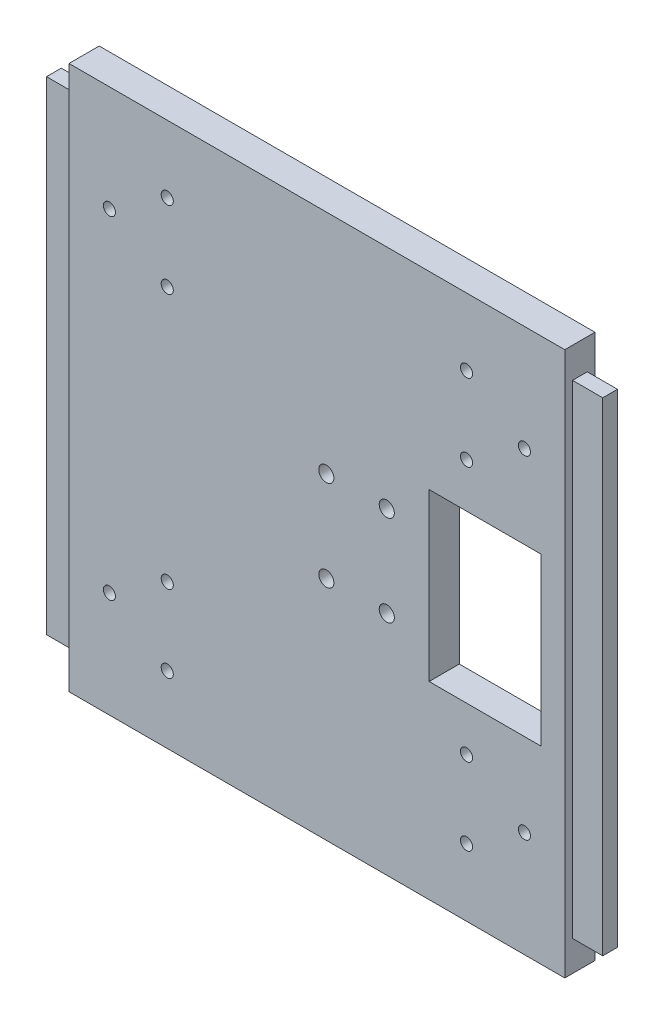
ISO-10303-21;
HEADER;
FILE_DESCRIPTION(('STEP AP214'),'2;1');
FILE_NAME('part.step','',(''),(''),'','','');
FILE_SCHEMA(('AUTOMOTIVE_DESIGN { 1 0 10303 214 1 1 1 1 }'));
ENDSEC;
DATA;
#1=APPLICATION_CONTEXT('core data for automotive mechanical design processes');
#2=APPLICATION_PROTOCOL_DEFINITION('international standard','automotive_design',2000,#1);
#3=PRODUCT_CONTEXT('',#1,'mechanical');
#4=PRODUCT('Part','Part','',(#3));
#5=PRODUCT_RELATED_PRODUCT_CATEGORY('part','',(#4));
#6=PRODUCT_DEFINITION_FORMATION('','',#4);
#7=PRODUCT_DEFINITION_CONTEXT('part definition',#1,'design');
#8=PRODUCT_DEFINITION('design','',#6,#7);
#9=PRODUCT_DEFINITION_SHAPE('','',#8);
#10=(LENGTH_UNIT() NAMED_UNIT(*) SI_UNIT(.MILLI.,.METRE.));
#11=(NAMED_UNIT(*) PLANE_ANGLE_UNIT() SI_UNIT($,.RADIAN.));
#12=(NAMED_UNIT(*) SI_UNIT($,.STERADIAN.) SOLID_ANGLE_UNIT());
#13=UNCERTAINTY_MEASURE_WITH_UNIT(LENGTH_MEASURE(1.E-05),#10,'distance_accuracy_value','');
#14=(GEOMETRIC_REPRESENTATION_CONTEXT(3) GLOBAL_UNCERTAINTY_ASSIGNED_CONTEXT((#13)) GLOBAL_UNIT_ASSIGNED_CONTEXT((#10,
#11,#12)) REPRESENTATION_CONTEXT('',''));
#15=CARTESIAN_POINT('',(0.,0.,0.));
#16=DIRECTION('',(0.,0.,1.));
#17=DIRECTION('',(1.,0.,0.));
#18=AXIS2_PLACEMENT_3D('',#15,#16,#17);
#19=CARTESIAN_POINT('',(0.,0.,10.));
#20=DIRECTION('',(1.,0.,0.));
#21=DIRECTION('',(0.,0.,-1.));
#22=AXIS2_PLACEMENT_3D('',#19,#20,#21);
#23=PLANE('',#22);
#24=DIRECTION('',(0.,-1.,0.));
#25=VECTOR('',#24,1.);
#26=CARTESIAN_POINT('',(0.,0.,0.));
#27=LINE('',#26,#25);
#28=CARTESIAN_POINT('',(0.,180.,0.));
#29=VERTEX_POINT('',#28);
#30=CARTESIAN_POINT('',(0.,0.,0.));
#31=VERTEX_POINT('',#30);
#32=EDGE_CURVE('E189',#29,#31,#27,.T.);
#33=ORIENTED_EDGE('',*,*,#32,.T.);
#34=DIRECTION('',(0.,0.,-1.));
#35=VECTOR('',#34,1.);
#36=CARTESIAN_POINT('',(0.,0.,10.));
#37=LINE('',#36,#35);
#38=CARTESIAN_POINT('',(0.,0.,10.));
#39=VERTEX_POINT('',#38);
#40=EDGE_CURVE('E162',#39,#31,#37,.T.);
#41=ORIENTED_EDGE('',*,*,#40,.F.);
#42=DIRECTION('',(0.,-1.,0.));
#43=VECTOR('',#42,1.);
#44=CARTESIAN_POINT('',(0.,0.,10.));
#45=LINE('',#44,#43);
#46=CARTESIAN_POINT('',(0.,180.,10.));
#47=VERTEX_POINT('',#46);
#48=EDGE_CURVE('E184',#47,#39,#45,.T.);
#49=ORIENTED_EDGE('',*,*,#48,.F.);
#50=DIRECTION('',(0.,0.,-1.));
#51=VECTOR('',#50,1.);
#52=CARTESIAN_POINT('',(0.,180.,10.));
#53=LINE('',#52,#51);
#54=EDGE_CURVE('E178',#47,#29,#53,.T.);
#55=ORIENTED_EDGE('',*,*,#54,.T.);
#56=EDGE_LOOP('',(#33,#41,#49,#55));
#57=FACE_BOUND('',#56,.T.);
#58=DIRECTION('',(0.,-1.,0.));
#59=VECTOR('',#58,1.);
#60=CARTESIAN_POINT('',(0.,169.94,2.55999999999999));
#61=LINE('',#60,#59);
#62=CARTESIAN_POINT('',(0.,169.94,2.55999999999999));
#63=VERTEX_POINT('',#62);
#64=CARTESIAN_POINT('',(0.,10.06,2.56000000000001));
#65=VERTEX_POINT('',#64);
#66=EDGE_CURVE('E222',#63,#65,#61,.T.);
#67=ORIENTED_EDGE('',*,*,#66,.F.);
#68=DIRECTION('',(0.,0.,-1.));
#69=VECTOR('',#68,1.);
#70=CARTESIAN_POINT('',(0.,169.94,2.55999999999999));
#71=LINE('',#70,#69);
#72=CARTESIAN_POINT('',(0.,169.94,7.43999999999999));
#73=VERTEX_POINT('',#72);
#74=EDGE_CURVE('E212',#73,#63,#71,.T.);
#75=ORIENTED_EDGE('',*,*,#74,.F.);
#76=DIRECTION('',(0.,1.,0.));
#77=VECTOR('',#76,1.);
#78=CARTESIAN_POINT('',(0.,169.94,7.43999999999999));
#79=LINE('',#78,#77);
#80=CARTESIAN_POINT('',(0.,10.06,7.44000000000001));
#81=VERTEX_POINT('',#80);
#82=EDGE_CURVE('E216',#81,#73,#79,.T.);
#83=ORIENTED_EDGE('',*,*,#82,.F.);
#84=DIRECTION('',(0.,0.,1.));
#85=VECTOR('',#84,1.);
#86=CARTESIAN_POINT('',(0.,10.06,2.56000000000001));
#87=LINE('',#86,#85);
#88=EDGE_CURVE('E219',#65,#81,#87,.T.);
#89=ORIENTED_EDGE('',*,*,#88,.F.);
#90=EDGE_LOOP('',(#67,#75,#83,#89));
#91=FACE_BOUND('',#90,.T.);
#92=ADVANCED_FACE('F37',(#57,#91),#23,.F.);
#93=CARTESIAN_POINT('',(0.,0.,10.));
#94=DIRECTION('',(0.,1.,0.));
#95=DIRECTION('',(0.,0.,1.));
#96=AXIS2_PLACEMENT_3D('',#93,#94,#95);
#97=PLANE('',#96);
#98=DIRECTION('',(1.,0.,0.));
#99=VECTOR('',#98,1.);
#100=CARTESIAN_POINT('',(0.,0.,0.));
#101=LINE('',#100,#99);
#102=CARTESIAN_POINT('',(164.,0.,0.));
#103=VERTEX_POINT('',#102);
#104=EDGE_CURVE('E187',#31,#103,#101,.T.);
#105=ORIENTED_EDGE('',*,*,#104,.T.);
#106=DIRECTION('',(0.,0.,-1.));
#107=VECTOR('',#106,1.);
#108=CARTESIAN_POINT('',(164.,0.,10.));
#109=LINE('',#108,#107);
#110=CARTESIAN_POINT('',(164.,0.,10.));
#111=VERTEX_POINT('',#110);
#112=EDGE_CURVE('E172',#111,#103,#109,.T.);
#113=ORIENTED_EDGE('',*,*,#112,.F.);
#114=DIRECTION('',(1.,0.,0.));
#115=VECTOR('',#114,1.);
#116=CARTESIAN_POINT('',(0.,0.,10.));
#117=LINE('',#116,#115);
#118=EDGE_CURVE('E196',#39,#111,#117,.T.);
#119=ORIENTED_EDGE('',*,*,#118,.F.);
#120=ORIENTED_EDGE('',*,*,#40,.T.);
#121=EDGE_LOOP('',(#105,#113,#119,#120));
#122=FACE_BOUND('',#121,.T.);
#123=ADVANCED_FACE('F425',(#122),#97,.F.);
#124=CARTESIAN_POINT('',(164.,0.,10.));
#125=DIRECTION('',(-1.,0.,0.));
#126=DIRECTION('',(0.,0.,1.));
#127=AXIS2_PLACEMENT_3D('',#124,#125,#126);
#128=PLANE('',#127);
#129=DIRECTION('',(0.,0.,-1.));
#130=VECTOR('',#129,1.);
#131=CARTESIAN_POINT('',(164.,169.94,2.55999999999999));
#132=LINE('',#131,#130);
#133=CARTESIAN_POINT('',(164.,169.94,7.43999999999999));
#134=VERTEX_POINT('',#133);
#135=CARTESIAN_POINT('',(164.,169.94,2.55999999999999));
#136=VERTEX_POINT('',#135);
#137=EDGE_CURVE('E249',#134,#136,#132,.T.);
#138=ORIENTED_EDGE('',*,*,#137,.T.);
#139=DIRECTION('',(0.,-1.,0.));
#140=VECTOR('',#139,1.);
#141=CARTESIAN_POINT('',(164.,169.94,2.55999999999999));
#142=LINE('',#141,#140);
#143=CARTESIAN_POINT('',(164.,10.06,2.56000000000001));
#144=VERTEX_POINT('',#143);
#145=EDGE_CURVE('E252',#136,#144,#142,.T.);
#146=ORIENTED_EDGE('',*,*,#145,.T.);
#147=DIRECTION('',(0.,0.,1.));
#148=VECTOR('',#147,1.);
#149=CARTESIAN_POINT('',(164.,10.06,2.56000000000001));
#150=LINE('',#149,#148);
#151=CARTESIAN_POINT('',(164.,10.06,7.44000000000001));
#152=VERTEX_POINT('',#151);
#153=EDGE_CURVE('E242',#144,#152,#150,.T.);
#154=ORIENTED_EDGE('',*,*,#153,.T.);
#155=DIRECTION('',(0.,1.,0.));
#156=VECTOR('',#155,1.);
#157=CARTESIAN_POINT('',(164.,169.94,7.43999999999999));
#158=LINE('',#157,#156);
#159=EDGE_CURVE('E246',#152,#134,#158,.T.);
#160=ORIENTED_EDGE('',*,*,#159,.T.);
#161=EDGE_LOOP('',(#138,#146,#154,#160));
#162=FACE_BOUND('',#161,.T.);
#163=DIRECTION('',(0.,1.,0.));
#164=VECTOR('',#163,1.);
#165=CARTESIAN_POINT('',(164.,0.,0.));
#166=LINE('',#165,#164);
#167=CARTESIAN_POINT('',(164.,180.,0.));
#168=VERTEX_POINT('',#167);
#169=EDGE_CURVE('E185',#103,#168,#166,.T.);
#170=ORIENTED_EDGE('',*,*,#169,.T.);
#171=DIRECTION('',(0.,0.,-1.));
#172=VECTOR('',#171,1.);
#173=CARTESIAN_POINT('',(164.,180.,10.));
#174=LINE('',#173,#172);
#175=CARTESIAN_POINT('',(164.,180.,10.));
#176=VERTEX_POINT('',#175);
#177=EDGE_CURVE('E175',#176,#168,#174,.T.);
#178=ORIENTED_EDGE('',*,*,#177,.F.);
#179=DIRECTION('',(0.,1.,0.));
#180=VECTOR('',#179,1.);
#181=CARTESIAN_POINT('',(164.,0.,10.));
#182=LINE('',#181,#180);
#183=EDGE_CURVE('E194',#111,#176,#182,.T.);
#184=ORIENTED_EDGE('',*,*,#183,.F.);
#185=ORIENTED_EDGE('',*,*,#112,.T.);
#186=EDGE_LOOP('',(#170,#178,#184,#185));
#187=FACE_BOUND('',#186,.T.);
#188=ADVANCED_FACE('F430',(#162,#187),#128,.F.);
#189=CARTESIAN_POINT('',(0.,180.,10.));
#190=DIRECTION('',(0.,-1.,0.));
#191=DIRECTION('',(0.,0.,-1.));
#192=AXIS2_PLACEMENT_3D('',#189,#190,#191);
#193=PLANE('',#192);
#194=DIRECTION('',(-1.,0.,0.));
#195=VECTOR('',#194,1.);
#196=CARTESIAN_POINT('',(0.,180.,0.));
#197=LINE('',#196,#195);
#198=EDGE_CURVE('E182',#168,#29,#197,.T.);
#199=ORIENTED_EDGE('',*,*,#198,.T.);
#200=ORIENTED_EDGE('',*,*,#54,.F.);
#201=DIRECTION('',(-1.,0.,0.));
#202=VECTOR('',#201,1.);
#203=CARTESIAN_POINT('',(0.,180.,10.));
#204=LINE('',#203,#202);
#205=EDGE_CURVE('E181',#176,#47,#204,.T.);
#206=ORIENTED_EDGE('',*,*,#205,.F.);
#207=ORIENTED_EDGE('',*,*,#177,.T.);
#208=EDGE_LOOP('',(#199,#200,#206,#207));
#209=FACE_BOUND('',#208,.T.);
#210=ADVANCED_FACE('F385',(#209),#193,.F.);
#211=CARTESIAN_POINT('',(0.,0.,10.));
#212=DIRECTION('',(0.,0.,-1.));
#213=DIRECTION('',(-1.,0.,0.));
#214=AXIS2_PLACEMENT_3D('',#211,#212,#213);
#215=PLANE('',#214);
#216=CARTESIAN_POINT('',(85.1178631754565,75.,10.));
#217=DIRECTION('',(0.,0.,1.));
#218=DIRECTION('',(1.,0.,0.));
#219=AXIS2_PLACEMENT_3D('',#216,#217,#218);
#220=CIRCLE('',#219,2.5);
#221=CARTESIAN_POINT('',(87.6178631754566,75.,10.));
#222=VERTEX_POINT('',#221);
#223=EDGE_CURVE('E153',#222,#222,#220,.T.);
#224=ORIENTED_EDGE('',*,*,#223,.F.);
#225=EDGE_LOOP('',(#224));
#226=FACE_BOUND('',#225,.T.);
#227=DIRECTION('',(1.,0.,0.));
#228=VECTOR('',#227,1.);
#229=CARTESIAN_POINT('',(119.117863175457,62.5,10.));
#230=LINE('',#229,#228);
#231=CARTESIAN_POINT('',(119.117863175457,62.5,10.));
#232=VERTEX_POINT('',#231);
#233=CARTESIAN_POINT('',(156.117863175457,62.5,10.));
#234=VERTEX_POINT('',#233);
#235=EDGE_CURVE('E352',#232,#234,#230,.T.);
#236=ORIENTED_EDGE('',*,*,#235,.F.);
#237=DIRECTION('',(0.,-1.,0.));
#238=VECTOR('',#237,1.);
#239=CARTESIAN_POINT('',(119.117863175457,117.5,10.));
#240=LINE('',#239,#238);
#241=CARTESIAN_POINT('',(119.117863175457,117.5,10.));
#242=VERTEX_POINT('',#241);
#243=EDGE_CURVE('E56',#242,#232,#240,.T.);
#244=ORIENTED_EDGE('',*,*,#243,.F.);
#245=DIRECTION('',(-1.,0.,0.));
#246=VECTOR('',#245,1.);
#247=CARTESIAN_POINT('',(119.117863175457,117.5,10.));
#248=LINE('',#247,#246);
#249=CARTESIAN_POINT('',(156.117863175457,117.5,10.));
#250=VERTEX_POINT('',#249);
#251=EDGE_CURVE('E152',#250,#242,#248,.T.);
#252=ORIENTED_EDGE('',*,*,#251,.F.);
#253=DIRECTION('',(0.,1.,0.));
#254=VECTOR('',#253,1.);
#255=CARTESIAN_POINT('',(156.117863175457,117.5,10.));
#256=LINE('',#255,#254);
#257=EDGE_CURVE('E349',#234,#250,#256,.T.);
#258=ORIENTED_EDGE('',*,*,#257,.F.);
#259=EDGE_LOOP('',(#236,#244,#252,#258));
#260=FACE_BOUND('',#259,.T.);
#261=CARTESIAN_POINT('',(105.117863175457,105.,10.));
#262=DIRECTION('',(0.,0.,1.));
#263=DIRECTION('',(1.,0.,0.));
#264=AXIS2_PLACEMENT_3D('',#261,#262,#263);
#265=CIRCLE('',#264,2.50000000000001);
#266=CARTESIAN_POINT('',(107.617863175457,105.,10.));
#267=VERTEX_POINT('',#266);
#268=EDGE_CURVE('E367',#267,#267,#265,.T.);
#269=ORIENTED_EDGE('',*,*,#268,.F.);
#270=EDGE_LOOP('',(#269));
#271=FACE_BOUND('',#270,.T.);
#272=CARTESIAN_POINT('',(105.117863175457,75.,10.));
#273=DIRECTION('',(0.,0.,1.));
#274=DIRECTION('',(1.,0.,0.));
#275=AXIS2_PLACEMENT_3D('',#272,#273,#274);
#276=CIRCLE('',#275,2.50000000000001);
#277=CARTESIAN_POINT('',(107.617863175457,75.,10.));
#278=VERTEX_POINT('',#277);
#279=EDGE_CURVE('E361',#278,#278,#276,.T.);
#280=ORIENTED_EDGE('',*,*,#279,.F.);
#281=EDGE_LOOP('',(#280));
#282=FACE_BOUND('',#281,.T.);
#283=CARTESIAN_POINT('',(85.1178631754565,105.,10.));
#284=DIRECTION('',(0.,0.,1.));
#285=DIRECTION('',(1.,0.,0.));
#286=AXIS2_PLACEMENT_3D('',#283,#284,#285);
#287=CIRCLE('',#286,2.5);
#288=CARTESIAN_POINT('',(87.6178631754566,105.,10.));
#289=VERTEX_POINT('',#288);
#290=EDGE_CURVE('E338',#289,#289,#287,.T.);
#291=ORIENTED_EDGE('',*,*,#290,.F.);
#292=EDGE_LOOP('',(#291));
#293=FACE_BOUND('',#292,.T.);
#294=CARTESIAN_POINT('',(150.642557300424,35.,10.));
#295=DIRECTION('',(0.,0.,-1.));
#296=DIRECTION('',(1.,0.,0.));
#297=AXIS2_PLACEMENT_3D('',#294,#295,#296);
#298=CIRCLE('',#297,2.);
#299=CARTESIAN_POINT('',(152.642557300424,35.,10.));
#300=VERTEX_POINT('',#299);
#301=EDGE_CURVE('E299',#300,#300,#298,.T.);
#302=ORIENTED_EDGE('',*,*,#301,.T.);
#303=EDGE_LOOP('',(#302));
#304=FACE_BOUND('',#303,.T.);
#305=CARTESIAN_POINT('',(131.5,22.25,10.));
#306=DIRECTION('',(0.,0.,-1.));
#307=DIRECTION('',(1.,0.,0.));
#308=AXIS2_PLACEMENT_3D('',#305,#306,#307);
#309=CIRCLE('',#308,2.);
#310=CARTESIAN_POINT('',(133.5,22.25,10.));
#311=VERTEX_POINT('',#310);
#312=EDGE_CURVE('E306',#311,#311,#309,.T.);
#313=ORIENTED_EDGE('',*,*,#312,.T.);
#314=EDGE_LOOP('',(#313));
#315=FACE_BOUND('',#314,.T.);
#316=CARTESIAN_POINT('',(131.5,47.75,10.));
#317=DIRECTION('',(0.,0.,-1.));
#318=DIRECTION('',(1.,0.,0.));
#319=AXIS2_PLACEMENT_3D('',#316,#317,#318);
#320=CIRCLE('',#319,2.);
#321=CARTESIAN_POINT('',(133.5,47.75,10.));
#322=VERTEX_POINT('',#321);
#323=EDGE_CURVE('E312',#322,#322,#320,.T.);
#324=ORIENTED_EDGE('',*,*,#323,.T.);
#325=EDGE_LOOP('',(#324));
#326=FACE_BOUND('',#325,.T.);
#327=CARTESIAN_POINT('',(32.5,132.25,10.));
#328=DIRECTION('',(0.,0.,-1.));
#329=DIRECTION('',(-1.,0.,0.));
#330=AXIS2_PLACEMENT_3D('',#327,#328,#329);
#331=CIRCLE('',#330,2.);
#332=CARTESIAN_POINT('',(30.5,132.25,10.));
#333=VERTEX_POINT('',#332);
#334=EDGE_CURVE('E276',#333,#333,#331,.T.);
#335=ORIENTED_EDGE('',*,*,#334,.T.);
#336=EDGE_LOOP('',(#335));
#337=FACE_BOUND('',#336,.T.);
#338=CARTESIAN_POINT('',(32.5,157.75,10.));
#339=DIRECTION('',(0.,0.,-1.));
#340=DIRECTION('',(-1.,0.,0.));
#341=AXIS2_PLACEMENT_3D('',#338,#339,#340);
#342=CIRCLE('',#341,2.00000000000001);
#343=CARTESIAN_POINT('',(30.5,157.75,10.));
#344=VERTEX_POINT('',#343);
#345=EDGE_CURVE('E275',#344,#344,#342,.T.);
#346=ORIENTED_EDGE('',*,*,#345,.T.);
#347=EDGE_LOOP('',(#346));
#348=FACE_BOUND('',#347,.T.);
#349=CARTESIAN_POINT('',(13.3574426995764,145.,10.));
#350=DIRECTION('',(0.,0.,-1.));
#351=DIRECTION('',(-1.,0.,0.));
#352=AXIS2_PLACEMENT_3D('',#349,#350,#351);
#353=CIRCLE('',#352,2.);
#354=CARTESIAN_POINT('',(11.3574426995764,145.,10.));
#355=VERTEX_POINT('',#354);
#356=EDGE_CURVE('E282',#355,#355,#353,.T.);
#357=ORIENTED_EDGE('',*,*,#356,.T.);
#358=EDGE_LOOP('',(#357));
#359=FACE_BOUND('',#358,.T.);
#360=CARTESIAN_POINT('',(131.5,132.25,10.));
#361=DIRECTION('',(0.,0.,-1.));
#362=DIRECTION('',(-1.,0.,0.));
#363=AXIS2_PLACEMENT_3D('',#360,#361,#362);
#364=CIRCLE('',#363,2.);
#365=CARTESIAN_POINT('',(129.5,132.25,10.));
#366=VERTEX_POINT('',#365);
#367=EDGE_CURVE('E288',#366,#366,#364,.T.);
#368=ORIENTED_EDGE('',*,*,#367,.T.);
#369=EDGE_LOOP('',(#368));
#370=FACE_BOUND('',#369,.T.);
#371=CARTESIAN_POINT('',(131.5,157.75,10.));
#372=DIRECTION('',(0.,0.,-1.));
#373=DIRECTION('',(-1.,0.,0.));
#374=AXIS2_PLACEMENT_3D('',#371,#372,#373);
#375=CIRCLE('',#374,2.);
#376=CARTESIAN_POINT('',(129.5,157.75,10.));
#377=VERTEX_POINT('',#376);
#378=EDGE_CURVE('E269',#377,#377,#375,.T.);
#379=ORIENTED_EDGE('',*,*,#378,.T.);
#380=EDGE_LOOP('',(#379));
#381=FACE_BOUND('',#380,.T.);
#382=CARTESIAN_POINT('',(32.5,47.75,10.));
#383=DIRECTION('',(0.,0.,-1.));
#384=DIRECTION('',(1.,0.,0.));
#385=AXIS2_PLACEMENT_3D('',#382,#383,#384);
#386=CIRCLE('',#385,2.);
#387=CARTESIAN_POINT('',(34.5,47.75,10.));
#388=VERTEX_POINT('',#387);
#389=EDGE_CURVE('E300',#388,#388,#386,.T.);
#390=ORIENTED_EDGE('',*,*,#389,.T.);
#391=EDGE_LOOP('',(#390));
#392=FACE_BOUND('',#391,.T.);
#393=CARTESIAN_POINT('',(32.5,22.25,10.));
#394=DIRECTION('',(0.,0.,-1.));
#395=DIRECTION('',(1.,0.,0.));
#396=AXIS2_PLACEMENT_3D('',#393,#394,#395);
#397=CIRCLE('',#396,2.00000000000001);
#398=CARTESIAN_POINT('',(34.5,22.25,10.));
#399=VERTEX_POINT('',#398);
#400=EDGE_CURVE('E330',#399,#399,#397,.T.);
#401=ORIENTED_EDGE('',*,*,#400,.T.);
#402=EDGE_LOOP('',(#401));
#403=FACE_BOUND('',#402,.T.);
#404=CARTESIAN_POINT('',(13.3574426995764,35.,10.));
#405=DIRECTION('',(0.,0.,-1.));
#406=DIRECTION('',(1.,0.,0.));
#407=AXIS2_PLACEMENT_3D('',#404,#405,#406);
#408=CIRCLE('',#407,2.);
#409=CARTESIAN_POINT('',(15.3574426995764,35.,10.));
#410=VERTEX_POINT('',#409);
#411=EDGE_CURVE('E323',#410,#410,#408,.T.);
#412=ORIENTED_EDGE('',*,*,#411,.T.);
#413=EDGE_LOOP('',(#412));
#414=FACE_BOUND('',#413,.T.);
#415=CARTESIAN_POINT('',(150.642557300424,145.,10.));
#416=DIRECTION('',(0.,0.,-1.));
#417=DIRECTION('',(-1.,0.,0.));
#418=AXIS2_PLACEMENT_3D('',#415,#416,#417);
#419=CIRCLE('',#418,2.);
#420=CARTESIAN_POINT('',(148.642557300424,145.,10.));
#421=VERTEX_POINT('',#420);
#422=EDGE_CURVE('E255',#421,#421,#419,.T.);
#423=ORIENTED_EDGE('',*,*,#422,.T.);
#424=EDGE_LOOP('',(#423));
#425=FACE_BOUND('',#424,.T.);
#426=ORIENTED_EDGE('',*,*,#48,.T.);
#427=ORIENTED_EDGE('',*,*,#118,.T.);
#428=ORIENTED_EDGE('',*,*,#183,.T.);
#429=ORIENTED_EDGE('',*,*,#205,.T.);
#430=EDGE_LOOP('',(#426,#427,#428,#429));
#431=FACE_BOUND('',#430,.T.);
#432=ADVANCED_FACE('F382',(#226,#260,#271,#282,#293,#304,#315,#326,#337,#348,#359,#370,#381,
#392,#403,#414,#425,#431),#215,.F.);
#433=CARTESIAN_POINT('',(0.,0.,0.));
#434=DIRECTION('',(0.,0.,-1.));
#435=DIRECTION('',(-1.,0.,0.));
#436=AXIS2_PLACEMENT_3D('',#433,#434,#435);
#437=PLANE('',#436);
#438=DIRECTION('',(1.,0.,0.));
#439=VECTOR('',#438,1.);
#440=CARTESIAN_POINT('',(0.,117.5,0.));
#441=LINE('',#440,#439);
#442=CARTESIAN_POINT('',(119.117863175457,117.5,0.));
#443=VERTEX_POINT('',#442);
#444=CARTESIAN_POINT('',(156.117863175457,117.5,0.));
#445=VERTEX_POINT('',#444);
#446=EDGE_CURVE('E11',#443,#445,#441,.T.);
#447=ORIENTED_EDGE('',*,*,#446,.F.);
#448=DIRECTION('',(0.,1.,0.));
#449=VECTOR('',#448,1.);
#450=CARTESIAN_POINT('',(119.117863175457,0.,0.));
#451=LINE('',#450,#449);
#452=CARTESIAN_POINT('',(119.117863175457,62.5,0.));
#453=VERTEX_POINT('',#452);
#454=EDGE_CURVE('E157',#453,#443,#451,.T.);
#455=ORIENTED_EDGE('',*,*,#454,.F.);
#456=DIRECTION('',(-1.,0.,0.));
#457=VECTOR('',#456,1.);
#458=CARTESIAN_POINT('',(0.,62.5,0.));
#459=LINE('',#458,#457);
#460=CARTESIAN_POINT('',(156.117863175457,62.5,0.));
#461=VERTEX_POINT('',#460);
#462=EDGE_CURVE('E161',#461,#453,#459,.T.);
#463=ORIENTED_EDGE('',*,*,#462,.F.);
#464=DIRECTION('',(0.,-1.,0.));
#465=VECTOR('',#464,1.);
#466=CARTESIAN_POINT('',(156.117863175457,0.,0.));
#467=LINE('',#466,#465);
#468=EDGE_CURVE('E44',#445,#461,#467,.T.);
#469=ORIENTED_EDGE('',*,*,#468,.F.);
#470=EDGE_LOOP('',(#447,#455,#463,#469));
#471=FACE_BOUND('',#470,.T.);
#472=CARTESIAN_POINT('',(150.642557300424,35.,0.));
#473=DIRECTION('',(0.,0.,-1.));
#474=DIRECTION('',(1.,0.,0.));
#475=AXIS2_PLACEMENT_3D('',#472,#473,#474);
#476=CIRCLE('',#475,2.);
#477=CARTESIAN_POINT('',(152.642557300424,35.,0.));
#478=VERTEX_POINT('',#477);
#479=EDGE_CURVE('E296',#478,#478,#476,.T.);
#480=ORIENTED_EDGE('',*,*,#479,.F.);
#481=EDGE_LOOP('',(#480));
#482=FACE_BOUND('',#481,.T.);
#483=CARTESIAN_POINT('',(131.5,22.25,0.));
#484=DIRECTION('',(0.,0.,-1.));
#485=DIRECTION('',(1.,0.,0.));
#486=AXIS2_PLACEMENT_3D('',#483,#484,#485);
#487=CIRCLE('',#486,2.);
#488=CARTESIAN_POINT('',(133.5,22.25,0.));
#489=VERTEX_POINT('',#488);
#490=EDGE_CURVE('E303',#489,#489,#487,.T.);
#491=ORIENTED_EDGE('',*,*,#490,.F.);
#492=EDGE_LOOP('',(#491));
#493=FACE_BOUND('',#492,.T.);
#494=CARTESIAN_POINT('',(131.5,47.75,0.));
#495=DIRECTION('',(0.,0.,-1.));
#496=DIRECTION('',(1.,0.,0.));
#497=AXIS2_PLACEMENT_3D('',#494,#495,#496);
#498=CIRCLE('',#497,2.);
#499=CARTESIAN_POINT('',(133.5,47.75,0.));
#500=VERTEX_POINT('',#499);
#501=EDGE_CURVE('E309',#500,#500,#498,.T.);
#502=ORIENTED_EDGE('',*,*,#501,.F.);
#503=EDGE_LOOP('',(#502));
#504=FACE_BOUND('',#503,.T.);
#505=CARTESIAN_POINT('',(32.5,132.25,0.));
#506=DIRECTION('',(0.,0.,-1.));
#507=DIRECTION('',(-1.,0.,0.));
#508=AXIS2_PLACEMENT_3D('',#505,#506,#507);
#509=CIRCLE('',#508,2.);
#510=CARTESIAN_POINT('',(30.5,132.25,0.));
#511=VERTEX_POINT('',#510);
#512=EDGE_CURVE('E315',#511,#511,#509,.T.);
#513=ORIENTED_EDGE('',*,*,#512,.F.);
#514=EDGE_LOOP('',(#513));
#515=FACE_BOUND('',#514,.T.);
#516=CARTESIAN_POINT('',(32.5,157.75,0.));
#517=DIRECTION('',(0.,0.,-1.));
#518=DIRECTION('',(-1.,0.,0.));
#519=AXIS2_PLACEMENT_3D('',#516,#517,#518);
#520=CIRCLE('',#519,2.00000000000001);
#521=CARTESIAN_POINT('',(30.5,157.75,0.));
#522=VERTEX_POINT('',#521);
#523=EDGE_CURVE('E272',#522,#522,#520,.T.);
#524=ORIENTED_EDGE('',*,*,#523,.F.);
#525=EDGE_LOOP('',(#524));
#526=FACE_BOUND('',#525,.T.);
#527=CARTESIAN_POINT('',(13.3574426995764,145.,0.));
#528=DIRECTION('',(0.,0.,-1.));
#529=DIRECTION('',(-1.,0.,0.));
#530=AXIS2_PLACEMENT_3D('',#527,#528,#529);
#531=CIRCLE('',#530,2.);
#532=CARTESIAN_POINT('',(11.3574426995764,145.,0.));
#533=VERTEX_POINT('',#532);
#534=EDGE_CURVE('E279',#533,#533,#531,.T.);
#535=ORIENTED_EDGE('',*,*,#534,.F.);
#536=EDGE_LOOP('',(#535));
#537=FACE_BOUND('',#536,.T.);
#538=CARTESIAN_POINT('',(131.5,132.25,0.));
#539=DIRECTION('',(0.,0.,-1.));
#540=DIRECTION('',(-1.,0.,0.));
#541=AXIS2_PLACEMENT_3D('',#538,#539,#540);
#542=CIRCLE('',#541,2.);
#543=CARTESIAN_POINT('',(129.5,132.25,0.));
#544=VERTEX_POINT('',#543);
#545=EDGE_CURVE('E285',#544,#544,#542,.T.);
#546=ORIENTED_EDGE('',*,*,#545,.F.);
#547=EDGE_LOOP('',(#546));
#548=FACE_BOUND('',#547,.T.);
#549=CARTESIAN_POINT('',(131.5,157.75,0.));
#550=DIRECTION('',(0.,0.,-1.));
#551=DIRECTION('',(-1.,0.,0.));
#552=AXIS2_PLACEMENT_3D('',#549,#550,#551);
#553=CIRCLE('',#552,2.);
#554=CARTESIAN_POINT('',(129.5,157.75,0.));
#555=VERTEX_POINT('',#554);
#556=EDGE_CURVE('E291',#555,#555,#553,.T.);
#557=ORIENTED_EDGE('',*,*,#556,.F.);
#558=EDGE_LOOP('',(#557));
#559=FACE_BOUND('',#558,.T.);
#560=CARTESIAN_POINT('',(32.5,47.75,0.));
#561=DIRECTION('',(0.,0.,-1.));
#562=DIRECTION('',(1.,0.,0.));
#563=AXIS2_PLACEMENT_3D('',#560,#561,#562);
#564=CIRCLE('',#563,2.);
#565=CARTESIAN_POINT('',(34.5,47.75,0.));
#566=VERTEX_POINT('',#565);
#567=EDGE_CURVE('E333',#566,#566,#564,.T.);
#568=ORIENTED_EDGE('',*,*,#567,.F.);
#569=EDGE_LOOP('',(#568));
#570=FACE_BOUND('',#569,.T.);
#571=CARTESIAN_POINT('',(32.5,22.25,0.));
#572=DIRECTION('',(0.,0.,-1.));
#573=DIRECTION('',(1.,0.,0.));
#574=AXIS2_PLACEMENT_3D('',#571,#572,#573);
#575=CIRCLE('',#574,2.00000000000001);
#576=CARTESIAN_POINT('',(34.5,22.25,0.));
#577=VERTEX_POINT('',#576);
#578=EDGE_CURVE('E327',#577,#577,#575,.T.);
#579=ORIENTED_EDGE('',*,*,#578,.F.);
#580=EDGE_LOOP('',(#579));
#581=FACE_BOUND('',#580,.T.);
#582=CARTESIAN_POINT('',(13.3574426995764,35.,0.));
#583=DIRECTION('',(0.,0.,-1.));
#584=DIRECTION('',(1.,0.,0.));
#585=AXIS2_PLACEMENT_3D('',#582,#583,#584);
#586=CIRCLE('',#585,2.);
#587=CARTESIAN_POINT('',(15.3574426995764,35.,0.));
#588=VERTEX_POINT('',#587);
#589=EDGE_CURVE('E320',#588,#588,#586,.T.);
#590=ORIENTED_EDGE('',*,*,#589,.F.);
#591=EDGE_LOOP('',(#590));
#592=FACE_BOUND('',#591,.T.);
#593=CARTESIAN_POINT('',(150.642557300424,145.,0.));
#594=DIRECTION('',(0.,0.,-1.));
#595=DIRECTION('',(-1.,0.,0.));
#596=AXIS2_PLACEMENT_3D('',#593,#594,#595);
#597=CIRCLE('',#596,2.);
#598=CARTESIAN_POINT('',(148.642557300424,145.,0.));
#599=VERTEX_POINT('',#598);
#600=EDGE_CURVE('E266',#599,#599,#597,.T.);
#601=ORIENTED_EDGE('',*,*,#600,.F.);
#602=EDGE_LOOP('',(#601));
#603=FACE_BOUND('',#602,.T.);
#604=ORIENTED_EDGE('',*,*,#32,.F.);
#605=ORIENTED_EDGE('',*,*,#198,.F.);
#606=ORIENTED_EDGE('',*,*,#169,.F.);
#607=ORIENTED_EDGE('',*,*,#104,.F.);
#608=EDGE_LOOP('',(#604,#605,#606,#607));
#609=FACE_BOUND('',#608,.T.);
#610=ADVANCED_FACE('F164',(#471,#482,#493,#504,#515,#526,#537,#548,#559,#570,#581,#592,#603,
#609),#437,.T.);
#611=CARTESIAN_POINT('',(-10.,169.94,2.55999999999999));
#612=DIRECTION('',(0.,0.,1.));
#613=DIRECTION('',(0.,-1.,0.));
#614=AXIS2_PLACEMENT_3D('',#611,#612,#613);
#615=PLANE('',#614);
#616=ORIENTED_EDGE('',*,*,#66,.T.);
#617=DIRECTION('',(1.,0.,0.));
#618=VECTOR('',#617,1.);
#619=CARTESIAN_POINT('',(-10.,10.06,2.56000000000001));
#620=LINE('',#619,#618);
#621=CARTESIAN_POINT('',(-10.,10.06,2.56000000000001));
#622=VERTEX_POINT('',#621);
#623=EDGE_CURVE('E192',#622,#65,#620,.T.);
#624=ORIENTED_EDGE('',*,*,#623,.F.);
#625=DIRECTION('',(0.,-1.,0.));
#626=VECTOR('',#625,1.);
#627=CARTESIAN_POINT('',(-10.,169.94,2.55999999999999));
#628=LINE('',#627,#626);
#629=CARTESIAN_POINT('',(-10.,169.94,2.55999999999999));
#630=VERTEX_POINT('',#629);
#631=EDGE_CURVE('E215',#630,#622,#628,.T.);
#632=ORIENTED_EDGE('',*,*,#631,.F.);
#633=DIRECTION('',(1.,0.,0.));
#634=VECTOR('',#633,1.);
#635=CARTESIAN_POINT('',(-10.,169.94,2.55999999999999));
#636=LINE('',#635,#634);
#637=EDGE_CURVE('E208',#630,#63,#636,.T.);
#638=ORIENTED_EDGE('',*,*,#637,.T.);
#639=EDGE_LOOP('',(#616,#624,#632,#638));
#640=FACE_BOUND('',#639,.T.);
#641=ADVANCED_FACE('F435',(#640),#615,.F.);
#642=CARTESIAN_POINT('',(-10.,10.06,2.56000000000001));
#643=DIRECTION('',(0.,1.,0.));
#644=DIRECTION('',(0.,0.,1.));
#645=AXIS2_PLACEMENT_3D('',#642,#643,#644);
#646=PLANE('',#645);
#647=ORIENTED_EDGE('',*,*,#88,.T.);
#648=DIRECTION('',(1.,0.,0.));
#649=VECTOR('',#648,1.);
#650=CARTESIAN_POINT('',(-10.,10.06,7.44000000000001));
#651=LINE('',#650,#649);
#652=CARTESIAN_POINT('',(-10.,10.06,7.44000000000001));
#653=VERTEX_POINT('',#652);
#654=EDGE_CURVE('E202',#653,#81,#651,.T.);
#655=ORIENTED_EDGE('',*,*,#654,.F.);
#656=DIRECTION('',(0.,0.,1.));
#657=VECTOR('',#656,1.);
#658=CARTESIAN_POINT('',(-10.,10.06,2.56000000000001));
#659=LINE('',#658,#657);
#660=EDGE_CURVE('E229',#622,#653,#659,.T.);
#661=ORIENTED_EDGE('',*,*,#660,.F.);
#662=ORIENTED_EDGE('',*,*,#623,.T.);
#663=EDGE_LOOP('',(#647,#655,#661,#662));
#664=FACE_BOUND('',#663,.T.);
#665=ADVANCED_FACE('F440',(#664),#646,.F.);
#666=CARTESIAN_POINT('',(-10.,169.94,7.43999999999999));
#667=DIRECTION('',(0.,0.,-1.));
#668=DIRECTION('',(0.,1.,0.));
#669=AXIS2_PLACEMENT_3D('',#666,#667,#668);
#670=PLANE('',#669);
#671=ORIENTED_EDGE('',*,*,#82,.T.);
#672=DIRECTION('',(1.,0.,0.));
#673=VECTOR('',#672,1.);
#674=CARTESIAN_POINT('',(-10.,169.94,7.43999999999999));
#675=LINE('',#674,#673);
#676=CARTESIAN_POINT('',(-10.,169.94,7.43999999999999));
#677=VERTEX_POINT('',#676);
#678=EDGE_CURVE('E205',#677,#73,#675,.T.);
#679=ORIENTED_EDGE('',*,*,#678,.F.);
#680=DIRECTION('',(0.,1.,0.));
#681=VECTOR('',#680,1.);
#682=CARTESIAN_POINT('',(-10.,169.94,7.43999999999999));
#683=LINE('',#682,#681);
#684=EDGE_CURVE('E227',#653,#677,#683,.T.);
#685=ORIENTED_EDGE('',*,*,#684,.F.);
#686=ORIENTED_EDGE('',*,*,#654,.T.);
#687=EDGE_LOOP('',(#671,#679,#685,#686));
#688=FACE_BOUND('',#687,.T.);
#689=ADVANCED_FACE('F671',(#688),#670,.F.);
#690=CARTESIAN_POINT('',(-10.,169.94,2.55999999999999));
#691=DIRECTION('',(0.,-1.,0.));
#692=DIRECTION('',(0.,0.,-1.));
#693=AXIS2_PLACEMENT_3D('',#690,#691,#692);
#694=PLANE('',#693);
#695=ORIENTED_EDGE('',*,*,#74,.T.);
#696=ORIENTED_EDGE('',*,*,#637,.F.);
#697=DIRECTION('',(0.,0.,-1.));
#698=VECTOR('',#697,1.);
#699=CARTESIAN_POINT('',(-10.,169.94,2.55999999999999));
#700=LINE('',#699,#698);
#701=EDGE_CURVE('E211',#677,#630,#700,.T.);
#702=ORIENTED_EDGE('',*,*,#701,.F.);
#703=ORIENTED_EDGE('',*,*,#678,.T.);
#704=EDGE_LOOP('',(#695,#696,#702,#703));
#705=FACE_BOUND('',#704,.T.);
#706=ADVANCED_FACE('F667',(#705),#694,.F.);
#707=CARTESIAN_POINT('',(-10.,0.,0.));
#708=DIRECTION('',(-1.,0.,0.));
#709=DIRECTION('',(0.,0.,1.));
#710=AXIS2_PLACEMENT_3D('',#707,#708,#709);
#711=PLANE('',#710);
#712=ORIENTED_EDGE('',*,*,#631,.T.);
#713=ORIENTED_EDGE('',*,*,#660,.T.);
#714=ORIENTED_EDGE('',*,*,#684,.T.);
#715=ORIENTED_EDGE('',*,*,#701,.T.);
#716=EDGE_LOOP('',(#712,#713,#714,#715));
#717=FACE_BOUND('',#716,.T.);
#718=ADVANCED_FACE('F663',(#717),#711,.T.);
#719=CARTESIAN_POINT('',(174.,169.94,2.55999999999999));
#720=DIRECTION('',(0.,0.,-1.));
#721=DIRECTION('',(0.,1.,0.));
#722=AXIS2_PLACEMENT_3D('',#719,#720,#721);
#723=PLANE('',#722);
#724=ORIENTED_EDGE('',*,*,#145,.F.);
#725=DIRECTION('',(-1.,0.,0.));
#726=VECTOR('',#725,1.);
#727=CARTESIAN_POINT('',(174.,169.94,2.55999999999999));
#728=LINE('',#727,#726);
#729=CARTESIAN_POINT('',(174.,169.94,2.55999999999999));
#730=VERTEX_POINT('',#729);
#731=EDGE_CURVE('E225',#730,#136,#728,.T.);
#732=ORIENTED_EDGE('',*,*,#731,.F.);
#733=DIRECTION('',(0.,-1.,0.));
#734=VECTOR('',#733,1.);
#735=CARTESIAN_POINT('',(174.,169.94,2.55999999999999));
#736=LINE('',#735,#734);
#737=CARTESIAN_POINT('',(174.,10.06,2.56000000000001));
#738=VERTEX_POINT('',#737);
#739=EDGE_CURVE('E245',#730,#738,#736,.T.);
#740=ORIENTED_EDGE('',*,*,#739,.T.);
#741=DIRECTION('',(-1.,0.,0.));
#742=VECTOR('',#741,1.);
#743=CARTESIAN_POINT('',(174.,10.06,2.56000000000001));
#744=LINE('',#743,#742);
#745=EDGE_CURVE('E239',#738,#144,#744,.T.);
#746=ORIENTED_EDGE('',*,*,#745,.T.);
#747=EDGE_LOOP('',(#724,#732,#740,#746));
#748=FACE_BOUND('',#747,.T.);
#749=ADVANCED_FACE('F659',(#748),#723,.T.);
#750=CARTESIAN_POINT('',(174.,169.94,2.55999999999999));
#751=DIRECTION('',(0.,1.,0.));
#752=DIRECTION('',(0.,0.,1.));
#753=AXIS2_PLACEMENT_3D('',#750,#751,#752);
#754=PLANE('',#753);
#755=ORIENTED_EDGE('',*,*,#137,.F.);
#756=DIRECTION('',(-1.,0.,0.));
#757=VECTOR('',#756,1.);
#758=CARTESIAN_POINT('',(174.,169.94,7.43999999999999));
#759=LINE('',#758,#757);
#760=CARTESIAN_POINT('',(174.,169.94,7.43999999999999));
#761=VERTEX_POINT('',#760);
#762=EDGE_CURVE('E235',#761,#134,#759,.T.);
#763=ORIENTED_EDGE('',*,*,#762,.F.);
#764=DIRECTION('',(0.,0.,-1.));
#765=VECTOR('',#764,1.);
#766=CARTESIAN_POINT('',(174.,169.94,2.55999999999999));
#767=LINE('',#766,#765);
#768=EDGE_CURVE('E261',#761,#730,#767,.T.);
#769=ORIENTED_EDGE('',*,*,#768,.T.);
#770=ORIENTED_EDGE('',*,*,#731,.T.);
#771=EDGE_LOOP('',(#755,#763,#769,#770));
#772=FACE_BOUND('',#771,.T.);
#773=ADVANCED_FACE('F655',(#772),#754,.T.);
#774=CARTESIAN_POINT('',(174.,169.94,7.43999999999999));
#775=DIRECTION('',(0.,0.,1.));
#776=DIRECTION('',(0.,-1.,0.));
#777=AXIS2_PLACEMENT_3D('',#774,#775,#776);
#778=PLANE('',#777);
#779=ORIENTED_EDGE('',*,*,#159,.F.);
#780=DIRECTION('',(-1.,0.,0.));
#781=VECTOR('',#780,1.);
#782=CARTESIAN_POINT('',(174.,10.06,7.44000000000001));
#783=LINE('',#782,#781);
#784=CARTESIAN_POINT('',(174.,10.06,7.44000000000001));
#785=VERTEX_POINT('',#784);
#786=EDGE_CURVE('E237',#785,#152,#783,.T.);
#787=ORIENTED_EDGE('',*,*,#786,.F.);
#788=DIRECTION('',(0.,1.,0.));
#789=VECTOR('',#788,1.);
#790=CARTESIAN_POINT('',(174.,169.94,7.43999999999999));
#791=LINE('',#790,#789);
#792=EDGE_CURVE('E258',#785,#761,#791,.T.);
#793=ORIENTED_EDGE('',*,*,#792,.T.);
#794=ORIENTED_EDGE('',*,*,#762,.T.);
#795=EDGE_LOOP('',(#779,#787,#793,#794));
#796=FACE_BOUND('',#795,.T.);
#797=ADVANCED_FACE('F651',(#796),#778,.T.);
#798=CARTESIAN_POINT('',(174.,10.06,2.56000000000001));
#799=DIRECTION('',(0.,-1.,0.));
#800=DIRECTION('',(0.,0.,-1.));
#801=AXIS2_PLACEMENT_3D('',#798,#799,#800);
#802=PLANE('',#801);
#803=ORIENTED_EDGE('',*,*,#153,.F.);
#804=ORIENTED_EDGE('',*,*,#745,.F.);
#805=DIRECTION('',(0.,0.,1.));
#806=VECTOR('',#805,1.);
#807=CARTESIAN_POINT('',(174.,10.06,2.56000000000001));
#808=LINE('',#807,#806);
#809=EDGE_CURVE('E241',#738,#785,#808,.T.);
#810=ORIENTED_EDGE('',*,*,#809,.T.);
#811=ORIENTED_EDGE('',*,*,#786,.T.);
#812=EDGE_LOOP('',(#803,#804,#810,#811));
#813=FACE_BOUND('',#812,.T.);
#814=ADVANCED_FACE('F647',(#813),#802,.T.);
#815=CARTESIAN_POINT('',(174.,0.,0.));
#816=DIRECTION('',(1.,0.,0.));
#817=DIRECTION('',(0.,0.,1.));
#818=AXIS2_PLACEMENT_3D('',#815,#816,#817);
#819=PLANE('',#818);
#820=ORIENTED_EDGE('',*,*,#739,.F.);
#821=ORIENTED_EDGE('',*,*,#768,.F.);
#822=ORIENTED_EDGE('',*,*,#792,.F.);
#823=ORIENTED_EDGE('',*,*,#809,.F.);
#824=EDGE_LOOP('',(#820,#821,#822,#823));
#825=FACE_BOUND('',#824,.T.);
#826=ADVANCED_FACE('F643',(#825),#819,.T.);
#827=CARTESIAN_POINT('',(150.642557300424,145.,10.));
#828=DIRECTION('',(0.,0.,-1.));
#829=DIRECTION('',(-1.,0.,0.));
#830=AXIS2_PLACEMENT_3D('',#827,#828,#829);
#831=CYLINDRICAL_SURFACE('',#830,2.);
#832=ORIENTED_EDGE('',*,*,#422,.F.);
#833=EDGE_LOOP('',(#832));
#834=FACE_BOUND('',#833,.T.);
#835=ORIENTED_EDGE('',*,*,#600,.T.);
#836=EDGE_LOOP('',(#835));
#837=FACE_BOUND('',#836,.T.);
#838=ADVANCED_FACE('F610',(#834,#837),#831,.F.);
#839=CARTESIAN_POINT('',(13.3574426995764,35.,10.));
#840=DIRECTION('',(0.,0.,-1.));
#841=DIRECTION('',(-1.,0.,0.));
#842=AXIS2_PLACEMENT_3D('',#839,#840,#841);
#843=CYLINDRICAL_SURFACE('',#842,2.);
#844=ORIENTED_EDGE('',*,*,#411,.F.);
#845=EDGE_LOOP('',(#844));
#846=FACE_BOUND('',#845,.T.);
#847=ORIENTED_EDGE('',*,*,#589,.T.);
#848=EDGE_LOOP('',(#847));
#849=FACE_BOUND('',#848,.T.);
#850=ADVANCED_FACE('F606',(#846,#849),#843,.F.);
#851=CARTESIAN_POINT('',(32.5,22.25,10.));
#852=DIRECTION('',(0.,0.,-1.));
#853=DIRECTION('',(-1.,0.,0.));
#854=AXIS2_PLACEMENT_3D('',#851,#852,#853);
#855=CYLINDRICAL_SURFACE('',#854,2.00000000000001);
#856=ORIENTED_EDGE('',*,*,#400,.F.);
#857=EDGE_LOOP('',(#856));
#858=FACE_BOUND('',#857,.T.);
#859=ORIENTED_EDGE('',*,*,#578,.T.);
#860=EDGE_LOOP('',(#859));
#861=FACE_BOUND('',#860,.T.);
#862=ADVANCED_FACE('F602',(#858,#861),#855,.F.);
#863=CARTESIAN_POINT('',(32.5,47.75,10.));
#864=DIRECTION('',(0.,0.,-1.));
#865=DIRECTION('',(-1.,0.,0.));
#866=AXIS2_PLACEMENT_3D('',#863,#864,#865);
#867=CYLINDRICAL_SURFACE('',#866,2.);
#868=ORIENTED_EDGE('',*,*,#389,.F.);
#869=EDGE_LOOP('',(#868));
#870=FACE_BOUND('',#869,.T.);
#871=ORIENTED_EDGE('',*,*,#567,.T.);
#872=EDGE_LOOP('',(#871));
#873=FACE_BOUND('',#872,.T.);
#874=ADVANCED_FACE('F598',(#870,#873),#867,.F.);
#875=CARTESIAN_POINT('',(131.5,157.75,10.));
#876=DIRECTION('',(0.,0.,-1.));
#877=DIRECTION('',(-1.,0.,0.));
#878=AXIS2_PLACEMENT_3D('',#875,#876,#877);
#879=CYLINDRICAL_SURFACE('',#878,2.);
#880=ORIENTED_EDGE('',*,*,#378,.F.);
#881=EDGE_LOOP('',(#880));
#882=FACE_BOUND('',#881,.T.);
#883=ORIENTED_EDGE('',*,*,#556,.T.);
#884=EDGE_LOOP('',(#883));
#885=FACE_BOUND('',#884,.T.);
#886=ADVANCED_FACE('F601',(#882,#885),#879,.F.);
#887=CARTESIAN_POINT('',(131.5,132.25,10.));
#888=DIRECTION('',(0.,0.,-1.));
#889=DIRECTION('',(-1.,0.,0.));
#890=AXIS2_PLACEMENT_3D('',#887,#888,#889);
#891=CYLINDRICAL_SURFACE('',#890,2.);
#892=ORIENTED_EDGE('',*,*,#367,.F.);
#893=EDGE_LOOP('',(#892));
#894=FACE_BOUND('',#893,.T.);
#895=ORIENTED_EDGE('',*,*,#545,.T.);
#896=EDGE_LOOP('',(#895));
#897=FACE_BOUND('',#896,.T.);
#898=ADVANCED_FACE('F629',(#894,#897),#891,.F.);
#899=CARTESIAN_POINT('',(13.3574426995764,145.,10.));
#900=DIRECTION('',(0.,0.,-1.));
#901=DIRECTION('',(-1.,0.,0.));
#902=AXIS2_PLACEMENT_3D('',#899,#900,#901);
#903=CYLINDRICAL_SURFACE('',#902,2.);
#904=ORIENTED_EDGE('',*,*,#356,.F.);
#905=EDGE_LOOP('',(#904));
#906=FACE_BOUND('',#905,.T.);
#907=ORIENTED_EDGE('',*,*,#534,.T.);
#908=EDGE_LOOP('',(#907));
#909=FACE_BOUND('',#908,.T.);
#910=ADVANCED_FACE('F633',(#906,#909),#903,.F.);
#911=CARTESIAN_POINT('',(32.5,157.75,10.));
#912=DIRECTION('',(0.,0.,-1.));
#913=DIRECTION('',(-1.,0.,0.));
#914=AXIS2_PLACEMENT_3D('',#911,#912,#913);
#915=CYLINDRICAL_SURFACE('',#914,2.00000000000001);
#916=ORIENTED_EDGE('',*,*,#345,.F.);
#917=EDGE_LOOP('',(#916));
#918=FACE_BOUND('',#917,.T.);
#919=ORIENTED_EDGE('',*,*,#523,.T.);
#920=EDGE_LOOP('',(#919));
#921=FACE_BOUND('',#920,.T.);
#922=ADVANCED_FACE('F616',(#918,#921),#915,.F.);
#923=CARTESIAN_POINT('',(32.5,132.25,10.));
#924=DIRECTION('',(0.,0.,-1.));
#925=DIRECTION('',(-1.,0.,0.));
#926=AXIS2_PLACEMENT_3D('',#923,#924,#925);
#927=CYLINDRICAL_SURFACE('',#926,2.);
#928=ORIENTED_EDGE('',*,*,#334,.F.);
#929=EDGE_LOOP('',(#928));
#930=FACE_BOUND('',#929,.T.);
#931=ORIENTED_EDGE('',*,*,#512,.T.);
#932=EDGE_LOOP('',(#931));
#933=FACE_BOUND('',#932,.T.);
#934=ADVANCED_FACE('F612',(#930,#933),#927,.F.);
#935=CARTESIAN_POINT('',(131.5,47.75,10.));
#936=DIRECTION('',(0.,0.,-1.));
#937=DIRECTION('',(-1.,0.,0.));
#938=AXIS2_PLACEMENT_3D('',#935,#936,#937);
#939=CYLINDRICAL_SURFACE('',#938,2.);
#940=ORIENTED_EDGE('',*,*,#323,.F.);
#941=EDGE_LOOP('',(#940));
#942=FACE_BOUND('',#941,.T.);
#943=ORIENTED_EDGE('',*,*,#501,.T.);
#944=EDGE_LOOP('',(#943));
#945=FACE_BOUND('',#944,.T.);
#946=ADVANCED_FACE('F615',(#942,#945),#939,.F.);
#947=CARTESIAN_POINT('',(131.5,22.25,10.));
#948=DIRECTION('',(0.,0.,-1.));
#949=DIRECTION('',(-1.,0.,0.));
#950=AXIS2_PLACEMENT_3D('',#947,#948,#949);
#951=CYLINDRICAL_SURFACE('',#950,2.);
#952=ORIENTED_EDGE('',*,*,#312,.F.);
#953=EDGE_LOOP('',(#952));
#954=FACE_BOUND('',#953,.T.);
#955=ORIENTED_EDGE('',*,*,#490,.T.);
#956=EDGE_LOOP('',(#955));
#957=FACE_BOUND('',#956,.T.);
#958=ADVANCED_FACE('F620',(#954,#957),#951,.F.);
#959=CARTESIAN_POINT('',(150.642557300424,35.,10.));
#960=DIRECTION('',(0.,0.,-1.));
#961=DIRECTION('',(-1.,0.,0.));
#962=AXIS2_PLACEMENT_3D('',#959,#960,#961);
#963=CYLINDRICAL_SURFACE('',#962,2.);
#964=ORIENTED_EDGE('',*,*,#301,.F.);
#965=EDGE_LOOP('',(#964));
#966=FACE_BOUND('',#965,.T.);
#967=ORIENTED_EDGE('',*,*,#479,.T.);
#968=EDGE_LOOP('',(#967));
#969=FACE_BOUND('',#968,.T.);
#970=ADVANCED_FACE('F469',(#966,#969),#963,.F.);
#971=CARTESIAN_POINT('',(85.1178631754565,105.,2.));
#972=DIRECTION('',(0.,0.,1.));
#973=DIRECTION('',(1.,0.,0.));
#974=AXIS2_PLACEMENT_3D('',#971,#972,#973);
#975=CYLINDRICAL_SURFACE('',#974,2.5);
#976=CARTESIAN_POINT('',(85.1178631754565,105.,2.));
#977=DIRECTION('',(0.,0.,1.));
#978=DIRECTION('',(1.,0.,0.));
#979=AXIS2_PLACEMENT_3D('',#976,#977,#978);
#980=CIRCLE('',#979,2.5);
#981=CARTESIAN_POINT('',(87.6178631754566,105.,2.));
#982=VERTEX_POINT('',#981);
#983=EDGE_CURVE('E324',#982,#982,#980,.T.);
#984=ORIENTED_EDGE('',*,*,#983,.F.);
#985=EDGE_LOOP('',(#984));
#986=FACE_BOUND('',#985,.T.);
#987=ORIENTED_EDGE('',*,*,#290,.T.);
#988=EDGE_LOOP('',(#987));
#989=FACE_BOUND('',#988,.T.);
#990=ADVANCED_FACE('F474',(#986,#989),#975,.F.);
#991=CARTESIAN_POINT('',(85.1178631754565,105.,2.));
#992=DIRECTION('',(0.,0.,1.));
#993=DIRECTION('',(1.,0.,0.));
#994=AXIS2_PLACEMENT_3D('',#991,#992,#993);
#995=PLANE('',#994);
#996=ORIENTED_EDGE('',*,*,#983,.T.);
#997=EDGE_LOOP('',(#996));
#998=FACE_BOUND('',#997,.T.);
#999=ADVANCED_FACE('F479',(#998),#995,.T.);
#1000=CARTESIAN_POINT('',(105.117863175457,75.,2.));
#1001=DIRECTION('',(0.,0.,1.));
#1002=DIRECTION('',(1.,0.,0.));
#1003=AXIS2_PLACEMENT_3D('',#1000,#1001,#1002);
#1004=CYLINDRICAL_SURFACE('',#1003,2.50000000000001);
#1005=CARTESIAN_POINT('',(105.117863175457,75.,2.));
#1006=DIRECTION('',(0.,0.,1.));
#1007=DIRECTION('',(1.,0.,0.));
#1008=AXIS2_PLACEMENT_3D('',#1005,#1006,#1007);
#1009=CIRCLE('',#1008,2.50000000000001);
#1010=CARTESIAN_POINT('',(107.617863175457,75.,2.));
#1011=VERTEX_POINT('',#1010);
#1012=EDGE_CURVE('E364',#1011,#1011,#1009,.T.);
#1013=ORIENTED_EDGE('',*,*,#1012,.F.);
#1014=EDGE_LOOP('',(#1013));
#1015=FACE_BOUND('',#1014,.T.);
#1016=ORIENTED_EDGE('',*,*,#279,.T.);
#1017=EDGE_LOOP('',(#1016));
#1018=FACE_BOUND('',#1017,.T.);
#1019=ADVANCED_FACE('F489',(#1015,#1018),#1004,.F.);
#1020=CARTESIAN_POINT('',(105.117863175457,75.,2.));
#1021=DIRECTION('',(0.,0.,1.));
#1022=DIRECTION('',(1.,0.,0.));
#1023=AXIS2_PLACEMENT_3D('',#1020,#1021,#1022);
#1024=PLANE('',#1023);
#1025=ORIENTED_EDGE('',*,*,#1012,.T.);
#1026=EDGE_LOOP('',(#1025));
#1027=FACE_BOUND('',#1026,.T.);
#1028=ADVANCED_FACE('F378',(#1027),#1024,.T.);
#1029=CARTESIAN_POINT('',(105.117863175457,105.,2.));
#1030=DIRECTION('',(0.,0.,1.));
#1031=DIRECTION('',(1.,0.,0.));
#1032=AXIS2_PLACEMENT_3D('',#1029,#1030,#1031);
#1033=CYLINDRICAL_SURFACE('',#1032,2.50000000000001);
#1034=CARTESIAN_POINT('',(105.117863175457,105.,2.));
#1035=DIRECTION('',(0.,0.,1.));
#1036=DIRECTION('',(1.,0.,0.));
#1037=AXIS2_PLACEMENT_3D('',#1034,#1035,#1036);
#1038=CIRCLE('',#1037,2.50000000000001);
#1039=CARTESIAN_POINT('',(107.617863175457,105.,2.));
#1040=VERTEX_POINT('',#1039);
#1041=EDGE_CURVE('E356',#1040,#1040,#1038,.T.);
#1042=ORIENTED_EDGE('',*,*,#1041,.F.);
#1043=EDGE_LOOP('',(#1042));
#1044=FACE_BOUND('',#1043,.T.);
#1045=ORIENTED_EDGE('',*,*,#268,.T.);
#1046=EDGE_LOOP('',(#1045));
#1047=FACE_BOUND('',#1046,.T.);
#1048=ADVANCED_FACE('F375',(#1044,#1047),#1033,.F.);
#1049=CARTESIAN_POINT('',(105.117863175457,105.,2.));
#1050=DIRECTION('',(0.,0.,1.));
#1051=DIRECTION('',(1.,0.,0.));
#1052=AXIS2_PLACEMENT_3D('',#1049,#1050,#1051);
#1053=PLANE('',#1052);
#1054=ORIENTED_EDGE('',*,*,#1041,.T.);
#1055=EDGE_LOOP('',(#1054));
#1056=FACE_BOUND('',#1055,.T.);
#1057=ADVANCED_FACE('F373',(#1056),#1053,.T.);
#1058=CARTESIAN_POINT('',(119.117863175457,117.5,2.));
#1059=DIRECTION('',(-1.,0.,0.));
#1060=DIRECTION('',(0.,-1.,0.));
#1061=AXIS2_PLACEMENT_3D('',#1058,#1059,#1060);
#1062=PLANE('',#1061);
#1063=ORIENTED_EDGE('',*,*,#243,.T.);
#1064=DIRECTION('',(0.,0.,1.));
#1065=VECTOR('',#1064,1.);
#1066=CARTESIAN_POINT('',(119.117863175457,62.5,2.));
#1067=LINE('',#1066,#1065);
#1068=EDGE_CURVE('E51',#453,#232,#1067,.T.);
#1069=ORIENTED_EDGE('',*,*,#1068,.F.);
#1070=ORIENTED_EDGE('',*,*,#454,.T.);
#1071=DIRECTION('',(0.,0.,1.));
#1072=VECTOR('',#1071,1.);
#1073=CARTESIAN_POINT('',(119.117863175457,117.5,2.));
#1074=LINE('',#1073,#1072);
#1075=EDGE_CURVE('E147',#443,#242,#1074,.T.);
#1076=ORIENTED_EDGE('',*,*,#1075,.T.);
#1077=EDGE_LOOP('',(#1063,#1069,#1070,#1076));
#1078=FACE_BOUND('',#1077,.T.);
#1079=ADVANCED_FACE('F158',(#1078),#1062,.F.);
#1080=CARTESIAN_POINT('',(119.117863175457,117.5,2.));
#1081=DIRECTION('',(0.,1.,0.));
#1082=DIRECTION('',(0.,0.,1.));
#1083=AXIS2_PLACEMENT_3D('',#1080,#1081,#1082);
#1084=PLANE('',#1083);
#1085=ORIENTED_EDGE('',*,*,#251,.T.);
#1086=ORIENTED_EDGE('',*,*,#1075,.F.);
#1087=ORIENTED_EDGE('',*,*,#446,.T.);
#1088=DIRECTION('',(0.,0.,1.));
#1089=VECTOR('',#1088,1.);
#1090=CARTESIAN_POINT('',(156.117863175457,117.5,2.));
#1091=LINE('',#1090,#1089);
#1092=EDGE_CURVE('E154',#445,#250,#1091,.T.);
#1093=ORIENTED_EDGE('',*,*,#1092,.T.);
#1094=EDGE_LOOP('',(#1085,#1086,#1087,#1093));
#1095=FACE_BOUND('',#1094,.T.);
#1096=ADVANCED_FACE('F148',(#1095),#1084,.F.);
#1097=CARTESIAN_POINT('',(156.117863175457,117.5,2.));
#1098=DIRECTION('',(1.,0.,0.));
#1099=DIRECTION('',(0.,1.,0.));
#1100=AXIS2_PLACEMENT_3D('',#1097,#1098,#1099);
#1101=PLANE('',#1100);
#1102=ORIENTED_EDGE('',*,*,#257,.T.);
#1103=ORIENTED_EDGE('',*,*,#1092,.F.);
#1104=ORIENTED_EDGE('',*,*,#468,.T.);
#1105=DIRECTION('',(0.,0.,1.));
#1106=VECTOR('',#1105,1.);
#1107=CARTESIAN_POINT('',(156.117863175457,62.5,2.));
#1108=LINE('',#1107,#1106);
#1109=EDGE_CURVE('E345',#461,#234,#1108,.T.);
#1110=ORIENTED_EDGE('',*,*,#1109,.T.);
#1111=EDGE_LOOP('',(#1102,#1103,#1104,#1110));
#1112=FACE_BOUND('',#1111,.T.);
#1113=ADVANCED_FACE('F567',(#1112),#1101,.F.);
#1114=CARTESIAN_POINT('',(119.117863175457,62.5,2.));
#1115=DIRECTION('',(0.,-1.,0.));
#1116=DIRECTION('',(0.,0.,-1.));
#1117=AXIS2_PLACEMENT_3D('',#1114,#1115,#1116);
#1118=PLANE('',#1117);
#1119=ORIENTED_EDGE('',*,*,#235,.T.);
#1120=ORIENTED_EDGE('',*,*,#1109,.F.);
#1121=ORIENTED_EDGE('',*,*,#462,.T.);
#1122=ORIENTED_EDGE('',*,*,#1068,.T.);
#1123=EDGE_LOOP('',(#1119,#1120,#1121,#1122));
#1124=FACE_BOUND('',#1123,.T.);
#1125=ADVANCED_FACE('F535',(#1124),#1118,.F.);
#1126=CARTESIAN_POINT('',(85.1178631754565,75.,2.));
#1127=DIRECTION('',(0.,0.,1.));
#1128=DIRECTION('',(1.,0.,0.));
#1129=AXIS2_PLACEMENT_3D('',#1126,#1127,#1128);
#1130=CYLINDRICAL_SURFACE('',#1129,2.5);
#1131=CARTESIAN_POINT('',(85.1178631754565,75.,2.));
#1132=DIRECTION('',(0.,0.,1.));
#1133=DIRECTION('',(1.,0.,0.));
#1134=AXIS2_PLACEMENT_3D('',#1131,#1132,#1133);
#1135=CIRCLE('',#1134,2.5);
#1136=CARTESIAN_POINT('',(87.6178631754566,75.,2.));
#1137=VERTEX_POINT('',#1136);
#1138=EDGE_CURVE('E341',#1137,#1137,#1135,.T.);
#1139=ORIENTED_EDGE('',*,*,#1138,.F.);
#1140=EDGE_LOOP('',(#1139));
#1141=FACE_BOUND('',#1140,.T.);
#1142=ORIENTED_EDGE('',*,*,#223,.T.);
#1143=EDGE_LOOP('',(#1142));
#1144=FACE_BOUND('',#1143,.T.);
#1145=ADVANCED_FACE('F529',(#1141,#1144),#1130,.F.);
#1146=CARTESIAN_POINT('',(85.1178631754565,75.,2.));
#1147=DIRECTION('',(0.,0.,1.));
#1148=DIRECTION('',(1.,0.,0.));
#1149=AXIS2_PLACEMENT_3D('',#1146,#1147,#1148);
#1150=PLANE('',#1149);
#1151=ORIENTED_EDGE('',*,*,#1138,.T.);
#1152=EDGE_LOOP('',(#1151));
#1153=FACE_BOUND('',#1152,.T.);
#1154=ADVANCED_FACE('F534',(#1153),#1150,.T.);
#1155=CLOSED_SHELL('',(#92,#123,#188,#210,#432,#610,#641,#665,#689,#706,#718,#749,#773,#797,
#814,#826,#838,#850,#862,#874,#886,#898,#910,#922,#934,#946,#958,#970,#990,#999,#1019,#1028,
#1048,#1057,#1079,#1096,#1113,#1125,#1145,#1154));
#1156=MANIFOLD_SOLID_BREP('B2',#1155);
#1157=ADVANCED_BREP_SHAPE_REPRESENTATION('',(#18,#1156),#14);
#1158=SHAPE_DEFINITION_REPRESENTATION(#9,#1157);
ENDSEC;
END-ISO-10303-21;
